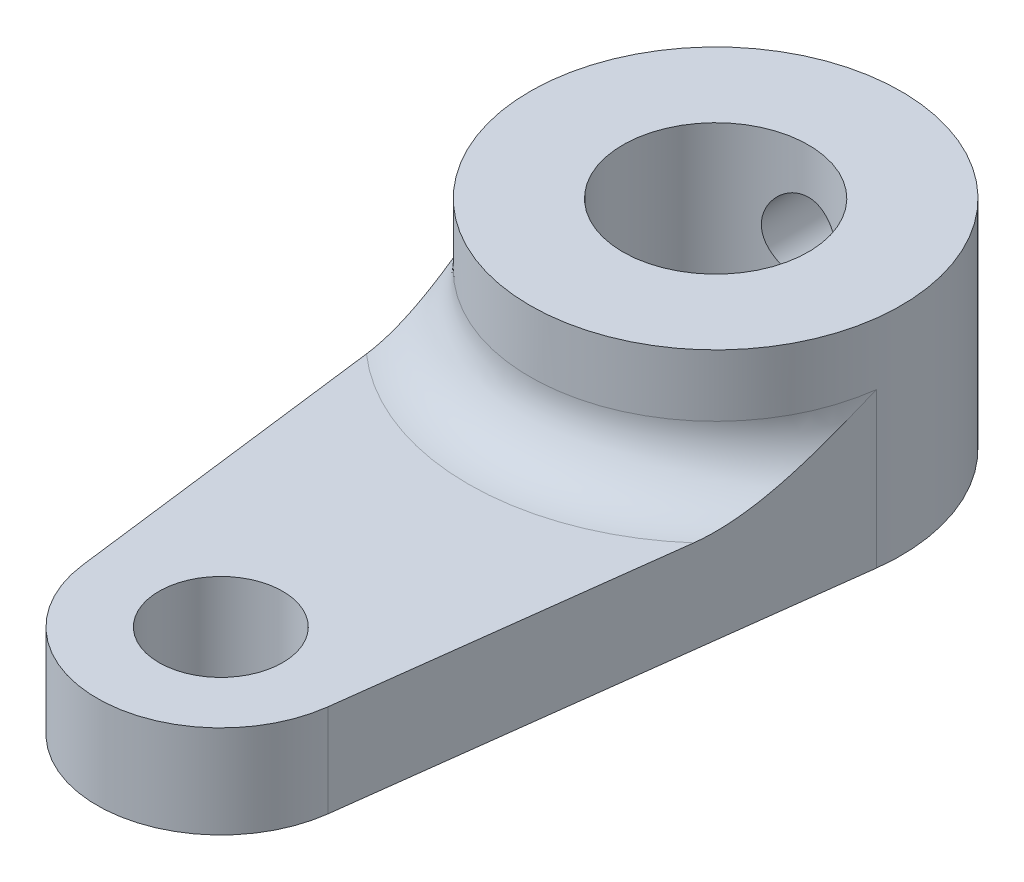
ISO-10303-21;
HEADER;
FILE_DESCRIPTION(('STEP AP214'),'2;1');
FILE_NAME('part.step','',(''),(''),'','','');
FILE_SCHEMA(('AUTOMOTIVE_DESIGN { 1 0 10303 214 1 1 1 1 }'));
ENDSEC;
DATA;
#1=APPLICATION_CONTEXT('core data for automotive mechanical design processes');
#2=APPLICATION_PROTOCOL_DEFINITION('international standard','automotive_design',2000,#1);
#3=PRODUCT_CONTEXT('',#1,'mechanical');
#4=PRODUCT('Part','Part','',(#3));
#5=PRODUCT_RELATED_PRODUCT_CATEGORY('part','',(#4));
#6=PRODUCT_DEFINITION_FORMATION('','',#4);
#7=PRODUCT_DEFINITION_CONTEXT('part definition',#1,'design');
#8=PRODUCT_DEFINITION('design','',#6,#7);
#9=PRODUCT_DEFINITION_SHAPE('','',#8);
#10=(LENGTH_UNIT() NAMED_UNIT(*) SI_UNIT(.MILLI.,.METRE.));
#11=(NAMED_UNIT(*) PLANE_ANGLE_UNIT() SI_UNIT($,.RADIAN.));
#12=(NAMED_UNIT(*) SI_UNIT($,.STERADIAN.) SOLID_ANGLE_UNIT());
#13=UNCERTAINTY_MEASURE_WITH_UNIT(LENGTH_MEASURE(1.E-05),#10,'distance_accuracy_value','');
#14=(GEOMETRIC_REPRESENTATION_CONTEXT(3) GLOBAL_UNCERTAINTY_ASSIGNED_CONTEXT((#13)) GLOBAL_UNIT_ASSIGNED_CONTEXT((#10,
#11,#12)) REPRESENTATION_CONTEXT('',''));
#15=CARTESIAN_POINT('',(0.,0.,0.));
#16=DIRECTION('',(0.,0.,1.));
#17=DIRECTION('',(1.,0.,0.));
#18=AXIS2_PLACEMENT_3D('',#15,#16,#17);
#19=CARTESIAN_POINT('',(-5.95294044989533,3.,0.750000000000001));
#20=DIRECTION('',(0.992156741649221,0.,-0.125));
#21=DIRECTION('',(-0.125,0.,-0.992156741649222));
#22=AXIS2_PLACEMENT_3D('',#19,#20,#21);
#23=PLANE('',#22);
#24=DIRECTION('',(0.125,0.,0.992156741649222));
#25=VECTOR('',#24,1.);
#26=CARTESIAN_POINT('',(-5.95294044989533,0.,0.750000000000001));
#27=LINE('',#26,#25);
#28=CARTESIAN_POINT('',(-5.95294044989533,0.,0.750000000000001));
#29=VERTEX_POINT('',#28);
#30=CARTESIAN_POINT('',(-3.96862696659688,0.,16.5));
#31=VERTEX_POINT('',#30);
#32=EDGE_CURVE('E167',#29,#31,#27,.T.);
#33=ORIENTED_EDGE('',*,*,#32,.T.);
#34=DIRECTION('',(0.,-1.,0.));
#35=VECTOR('',#34,1.);
#36=CARTESIAN_POINT('',(-3.96862696659688,3.,16.5));
#37=LINE('',#36,#35);
#38=CARTESIAN_POINT('',(-3.96862696659688,3.,16.5));
#39=VERTEX_POINT('',#38);
#40=EDGE_CURVE('E160',#39,#31,#37,.T.);
#41=ORIENTED_EDGE('',*,*,#40,.F.);
#42=DIRECTION('',(0.125,0.,0.992156741649222));
#43=VECTOR('',#42,1.);
#44=CARTESIAN_POINT('',(-5.95294044989533,3.,0.750000000000001));
#45=LINE('',#44,#43);
#46=CARTESIAN_POINT('',(-5.29150262212918,3.,6.00000000000001));
#47=VERTEX_POINT('',#46);
#48=EDGE_CURVE('E145',#47,#39,#45,.T.);
#49=ORIENTED_EDGE('',*,*,#48,.F.);
#50=CARTESIAN_POINT('',(-5.29150262212918,3.,6.));
#51=CARTESIAN_POINT('',(-5.310397819851,3.00003932371851,5.85002401756404));
#52=CARTESIAN_POINT('',(-5.32927068108449,3.00749080861603,5.70022532550789));
#53=CARTESIAN_POINT('',(-5.36682983971665,3.03529748814438,5.40210874592731));
#54=CARTESIAN_POINT('',(-5.38551644968357,3.05562506504866,5.25378837746932));
#55=CARTESIAN_POINT('',(-5.42237695613095,3.10690972129858,4.96121717769029));
#56=CARTESIAN_POINT('',(-5.44055436264534,3.13771036698731,4.81693848633871));
#57=CARTESIAN_POINT('',(-5.47663555915589,3.20848018103599,4.53055286742101));
#58=CARTESIAN_POINT('',(-5.49453918362412,3.24845467894677,4.38844725369214));
#59=CARTESIAN_POINT('',(-5.5510486235935,3.38804779430901,3.93991747903258));
#60=CARTESIAN_POINT('',(-5.58909054596903,3.50228369716539,3.63796908103118));
#61=CARTESIAN_POINT('',(-5.66384180156039,3.75580816906814,3.04464938357748));
#62=CARTESIAN_POINT('',(-5.70054954085285,3.89512559194255,2.75329073549981));
#63=CARTESIAN_POINT('',(-5.80963672037337,4.33812108027919,1.88743809078946));
#64=CARTESIAN_POINT('',(-5.88048240155337,4.66533067275,1.32511792919343));
#65=CARTESIAN_POINT('',(-5.95182241893324,4.99483605454566,0.758874095651245));
#66=CARTESIAN_POINT('',(-5.95238143594606,4.9974180439654,0.754437035667553));
#67=CARTESIAN_POINT('',(-5.95294044989533,5.,0.750000000000001));
#68=B_SPLINE_CURVE_WITH_KNOTS('',3,(#50,#51,#52,#53,#54,#55,#56,#57,#58,#59,#60,#61,#62,#63,#64,
#65,#66,#67),.UNSPECIFIED.,.F.,.F.,(4,2,2,2,2,2,2,2,4),(0.,0.453047985173654,0.905127510167307,
1.35073120961617,1.79659444088085,2.76988627914173,3.74430503334719,5.70583133706962,
5.72132327058452),.UNSPECIFIED.);
#69=CARTESIAN_POINT('',(-5.95294044989533,5.,0.750000000000001));
#70=VERTEX_POINT('',#69);
#71=EDGE_CURVE('E49',#47,#70,#68,.T.);
#72=ORIENTED_EDGE('',*,*,#71,.T.);
#73=DIRECTION('',(0.,-1.,0.));
#74=VECTOR('',#73,1.);
#75=CARTESIAN_POINT('',(-5.95294044989533,3.,0.750000000000001));
#76=LINE('',#75,#74);
#77=EDGE_CURVE('E332',#70,#29,#76,.T.);
#78=ORIENTED_EDGE('',*,*,#77,.T.);
#79=EDGE_LOOP('',(#33,#41,#49,#72,#78));
#80=FACE_BOUND('',#79,.T.);
#81=ADVANCED_FACE('F95',(#80),#23,.F.);
#82=CARTESIAN_POINT('',(0.,3.,16.));
#83=DIRECTION('',(0.,-1.,0.));
#84=DIRECTION('',(0.,0.,-1.));
#85=AXIS2_PLACEMENT_3D('',#82,#83,#84);
#86=CYLINDRICAL_SURFACE('',#85,4.);
#87=CARTESIAN_POINT('',(0.,0.,16.));
#88=DIRECTION('',(0.,1.,0.));
#89=DIRECTION('',(0.,0.,1.));
#90=AXIS2_PLACEMENT_3D('',#87,#88,#89);
#91=CIRCLE('',#90,4.);
#92=CARTESIAN_POINT('',(3.96862696659689,0.,16.5));
#93=VERTEX_POINT('',#92);
#94=EDGE_CURVE('E334',#31,#93,#91,.T.);
#95=ORIENTED_EDGE('',*,*,#94,.T.);
#96=DIRECTION('',(0.,-1.,0.));
#97=VECTOR('',#96,1.);
#98=CARTESIAN_POINT('',(3.96862696659689,3.,16.5));
#99=LINE('',#98,#97);
#100=CARTESIAN_POINT('',(3.96862696659689,3.,16.5));
#101=VERTEX_POINT('',#100);
#102=EDGE_CURVE('E162',#101,#93,#99,.T.);
#103=ORIENTED_EDGE('',*,*,#102,.F.);
#104=CARTESIAN_POINT('',(0.,3.,16.));
#105=DIRECTION('',(0.,1.,0.));
#106=DIRECTION('',(0.,0.,1.));
#107=AXIS2_PLACEMENT_3D('',#104,#105,#106);
#108=CIRCLE('',#107,4.);
#109=EDGE_CURVE('E149',#39,#101,#108,.T.);
#110=ORIENTED_EDGE('',*,*,#109,.F.);
#111=ORIENTED_EDGE('',*,*,#40,.T.);
#112=EDGE_LOOP('',(#95,#103,#110,#111));
#113=FACE_BOUND('',#112,.T.);
#114=ADVANCED_FACE('F159',(#113),#86,.T.);
#115=CARTESIAN_POINT('',(5.95294044989533,3.,0.75));
#116=DIRECTION('',(0.992156741649221,0.,0.125));
#117=DIRECTION('',(0.125,0.,-0.992156741649222));
#118=AXIS2_PLACEMENT_3D('',#115,#116,#117);
#119=PLANE('',#118);
#120=DIRECTION('',(-0.125,0.,0.992156741649222));
#121=VECTOR('',#120,1.);
#122=CARTESIAN_POINT('',(5.95294044989533,0.,0.75));
#123=LINE('',#122,#121);
#124=CARTESIAN_POINT('',(5.95294044989533,0.,0.749999999999999));
#125=VERTEX_POINT('',#124);
#126=EDGE_CURVE('E336',#125,#93,#123,.T.);
#127=ORIENTED_EDGE('',*,*,#126,.F.);
#128=DIRECTION('',(0.,-1.,0.));
#129=VECTOR('',#128,1.);
#130=CARTESIAN_POINT('',(5.95294044989533,3.,0.749999999999999));
#131=LINE('',#130,#129);
#132=CARTESIAN_POINT('',(5.95294044989533,5.,0.749999999999999));
#133=VERTEX_POINT('',#132);
#134=EDGE_CURVE('E172',#133,#125,#131,.T.);
#135=ORIENTED_EDGE('',*,*,#134,.F.);
#136=CARTESIAN_POINT('',(5.29150262212918,3.,6.));
#137=CARTESIAN_POINT('',(5.31039781985099,3.00003932371851,5.85002401756409));
#138=CARTESIAN_POINT('',(5.32927068108447,3.00749080861603,5.70022532550801));
#139=CARTESIAN_POINT('',(5.36682983971662,3.03529748814436,5.40210874592754));
#140=CARTESIAN_POINT('',(5.38551644968354,3.05562506504862,5.2537883774696));
#141=CARTESIAN_POINT('',(5.42237695613092,3.10690972129853,4.96121717769055));
#142=CARTESIAN_POINT('',(5.44055436264532,3.13771036698726,4.81693848633891));
#143=CARTESIAN_POINT('',(5.47663555915588,3.20848018103597,4.5305528674211));
#144=CARTESIAN_POINT('',(5.49453918362412,3.24845467894676,4.38844725369219));
#145=CARTESIAN_POINT('',(5.55104862359351,3.388047794309,3.93991747903254));
#146=CARTESIAN_POINT('',(5.58909054596904,3.50228369716534,3.63796908103107));
#147=CARTESIAN_POINT('',(5.66384180156041,3.75580816906828,3.04464938357737));
#148=CARTESIAN_POINT('',(5.70054954085285,3.89512559194294,2.75329073549976));
#149=CARTESIAN_POINT('',(5.80963672037344,4.33812108027873,1.8874380907889));
#150=CARTESIAN_POINT('',(5.88048240155366,4.66533067274692,1.32511792919142));
#151=CARTESIAN_POINT('',(5.95182241893326,4.99483605454567,0.75887409565111));
#152=CARTESIAN_POINT('',(5.95238143594607,4.9974180439654,0.754437035667485));
#153=CARTESIAN_POINT('',(5.95294044989533,5.,0.75));
#154=B_SPLINE_CURVE_WITH_KNOTS('',3,(#136,#137,#138,#139,#140,#141,#142,#143,#144,#145,#146,
#147,#148,#149,#150,#151,#152,#153),.UNSPECIFIED.,.F.,.F.,(4,2,2,2,2,2,2,2,4),(0.,
0.453047985173469,0.905127510166978,1.35073120961602,1.79659444088085,2.76988627914183,
3.74430503334748,5.70583133706981,5.72132327058452),.UNSPECIFIED.);
#155=CARTESIAN_POINT('',(5.29150262212918,3.,6.));
#156=VERTEX_POINT('',#155);
#157=EDGE_CURVE('E109',#133,#156,#154,.F.);
#158=ORIENTED_EDGE('',*,*,#157,.T.);
#159=DIRECTION('',(-0.125,0.,0.992156741649222));
#160=VECTOR('',#159,1.);
#161=CARTESIAN_POINT('',(5.95294044989533,3.,0.75));
#162=LINE('',#161,#160);
#163=EDGE_CURVE('E163',#156,#101,#162,.T.);
#164=ORIENTED_EDGE('',*,*,#163,.T.);
#165=ORIENTED_EDGE('',*,*,#102,.T.);
#166=EDGE_LOOP('',(#127,#135,#158,#164,#165));
#167=FACE_BOUND('',#166,.T.);
#168=ADVANCED_FACE('F184',(#167),#119,.T.);
#169=CARTESIAN_POINT('',(0.,3.,0.));
#170=DIRECTION('',(0.,-1.,0.));
#171=DIRECTION('',(0.,0.,-1.));
#172=AXIS2_PLACEMENT_3D('',#169,#170,#171);
#173=CYLINDRICAL_SURFACE('',#172,3.);
#174=CARTESIAN_POINT('',(0.,5.53515299842047,-3.));
#175=CARTESIAN_POINT('',(-0.0669580526362667,5.53514579332917,-2.99999458367273));
#176=CARTESIAN_POINT('',(-0.134021397063841,5.52974103989234,-2.9977323297471));
#177=CARTESIAN_POINT('',(-0.266247371156347,5.50831393350029,-2.98890153579552));
#178=CARTESIAN_POINT('',(-0.331404576423564,5.49226387395622,-2.98232175901028));
#179=CARTESIAN_POINT('',(-0.457688733653087,5.45024190663988,-2.96556289038127));
#180=CARTESIAN_POINT('',(-0.518828524426268,5.42430360895232,-2.95539599975004));
#181=CARTESIAN_POINT('',(-0.635829756679802,5.3633801751879,-2.93245286470664));
#182=CARTESIAN_POINT('',(-0.691692790015939,5.32839777944961,-2.91967741092849));
#183=CARTESIAN_POINT('',(-0.799448403559511,5.24852401582959,-2.89207828351869));
#184=CARTESIAN_POINT('',(-0.851041267517768,5.20325168963072,-2.87718753326093));
#185=CARTESIAN_POINT('',(-0.946159821091261,5.1048886636379,-2.84732714068514));
#186=CARTESIAN_POINT('',(-0.989681263153085,5.05179387352596,-2.83235746106809));
#187=CARTESIAN_POINT('',(-1.06953737697065,4.93612622085558,-2.80321021812995));
#188=CARTESIAN_POINT('',(-1.10541308153925,4.87321554999393,-2.78910786873385));
#189=CARTESIAN_POINT('',(-1.16593940588866,4.74157974049954,-2.76435572357005));
#190=CARTESIAN_POINT('',(-1.19059580836291,4.67285761893602,-2.75370415000824));
#191=CARTESIAN_POINT('',(-1.22674598312159,4.53499930665255,-2.73778555387705));
#192=CARTESIAN_POINT('',(-1.23881657877605,4.46604251502832,-2.73228387651787));
#193=CARTESIAN_POINT('',(-1.25125209967796,4.3268797057339,-2.72661326219504));
#194=CARTESIAN_POINT('',(-1.25162348054397,4.25667439839473,-2.7264413842526));
#195=CARTESIAN_POINT('',(-1.24108450363674,4.12275293798553,-2.73125119560853));
#196=CARTESIAN_POINT('',(-1.23103681112301,4.05895190185601,-2.73583882723623));
#197=CARTESIAN_POINT('',(-1.20139191015777,3.93404090742008,-2.74898482773796));
#198=CARTESIAN_POINT('',(-1.18179287287177,3.8729314669287,-2.75754395703564));
#199=CARTESIAN_POINT('',(-1.13321958727571,3.75359529542903,-2.77786184772756));
#200=CARTESIAN_POINT('',(-1.10405471539236,3.69545757750709,-2.78968481949136));
#201=CARTESIAN_POINT('',(-1.03731242580562,3.58467526454033,-2.81518331141086));
#202=CARTESIAN_POINT('',(-0.999731690519544,3.53203284780695,-2.82885956129779));
#203=CARTESIAN_POINT('',(-0.913495965543835,3.42905303968763,-2.85792976877979));
#204=CARTESIAN_POINT('',(-0.864173483207526,3.37928643103504,-2.87337121404473));
#205=CARTESIAN_POINT('',(-0.757729591051512,3.28853949546129,-2.90325673112529));
#206=CARTESIAN_POINT('',(-0.700606359448457,3.24756122672829,-2.9177005687701));
#207=CARTESIAN_POINT('',(-0.578447948693377,3.17471717480421,-2.94438283556473));
#208=CARTESIAN_POINT('',(-0.513260582447681,3.14308355326979,-2.95656266543334));
#209=CARTESIAN_POINT('',(-0.377852402526832,3.09143185881721,-2.97689481414803));
#210=CARTESIAN_POINT('',(-0.307634394795035,3.07140736647666,-2.985049358458));
#211=CARTESIAN_POINT('',(-0.168928113346229,3.04473700629384,-2.99599641186385));
#212=CARTESIAN_POINT('',(-0.10061128527864,3.03732514097672,-2.99909541047125));
#213=CARTESIAN_POINT('',(0.0363546554960885,3.03380677480638,-3.00056050368745));
#214=CARTESIAN_POINT('',(0.105003667152635,3.03769702816847,-2.99892795711939));
#215=CARTESIAN_POINT('',(0.237098242341434,3.05612408322654,-2.9913121765694));
#216=CARTESIAN_POINT('',(0.300632966639385,3.07012295251767,-2.9855488728399));
#217=CARTESIAN_POINT('',(0.424382748971089,3.10762119296126,-2.97048606772414));
#218=CARTESIAN_POINT('',(0.48459738651836,3.13112176437077,-2.96118611959704));
#219=CARTESIAN_POINT('',(0.602108999869136,3.18772397413259,-2.93958270645166));
#220=CARTESIAN_POINT('',(0.659257236855323,3.22110118156651,-2.92719491469281));
#221=CARTESIAN_POINT('',(0.767346216231429,3.29620637621217,-2.9007380457909));
#222=CARTESIAN_POINT('',(0.81828435260194,3.33793784994975,-2.88666826768733));
#223=CARTESIAN_POINT('',(0.916333430274263,3.43205623169288,-2.85712087895438));
#224=CARTESIAN_POINT('',(0.962910697979835,3.48499150140673,-2.84161451591029));
#225=CARTESIAN_POINT('',(1.04666984610551,3.59817427435586,-2.81184336768005));
#226=CARTESIAN_POINT('',(1.08384959285617,3.65842343359221,-2.79757886493439));
#227=CARTESIAN_POINT('',(1.14815960208699,3.78576717372305,-2.77181386243988));
#228=CARTESIAN_POINT('',(1.17513918237329,3.8529470339353,-2.76035562555112));
#229=CARTESIAN_POINT('',(1.21717413951573,3.99152359223058,-2.74208355658957));
#230=CARTESIAN_POINT('',(1.23223934863687,4.06291676090382,-2.73526589555752));
#231=CARTESIAN_POINT('',(1.249040803489,4.20197169761968,-2.72763164537264));
#232=CARTESIAN_POINT('',(1.25171380413129,4.26949766071309,-2.72639350967163));
#233=CARTESIAN_POINT('',(1.24615575523912,4.40399585956157,-2.72893853011024));
#234=CARTESIAN_POINT('',(1.23792637964721,4.47096817873417,-2.73272091540306));
#235=CARTESIAN_POINT('',(1.21158404780491,4.59924574588936,-2.74449551302268));
#236=CARTESIAN_POINT('',(1.19394903571466,4.66066967188386,-2.7522835484648));
#237=CARTESIAN_POINT('',(1.14976328202134,4.7797010197777,-2.77103181199189));
#238=CARTESIAN_POINT('',(1.12321003517252,4.83730736381925,-2.78199293131693));
#239=CARTESIAN_POINT('',(1.06010285935489,4.95084889436959,-2.80666954560013));
#240=CARTESIAN_POINT('',(1.02304360910483,5.00647532858876,-2.82051102713679));
#241=CARTESIAN_POINT('',(0.940684072630391,5.11101313778115,-2.84903689053839));
#242=CARTESIAN_POINT('',(0.895380928905619,5.15992217402104,-2.86372156345875));
#243=CARTESIAN_POINT('',(0.793902045778821,5.25330168010521,-2.89356392850106));
#244=CARTESIAN_POINT('',(0.737174739949028,5.29718943126112,-2.90867817511792));
#245=CARTESIAN_POINT('',(0.616600079253199,5.3748524519641,-2.9366014362202));
#246=CARTESIAN_POINT('',(0.552749497945746,5.40862311331003,-2.9494093991674));
#247=CARTESIAN_POINT('',(0.420732056717951,5.46436284386036,-2.97109183362461));
#248=CARTESIAN_POINT('',(0.352653990980636,5.48651776503777,-2.98002782581964));
#249=CARTESIAN_POINT('',(0.213410421846559,5.51885932749831,-2.99321009768625));
#250=CARTESIAN_POINT('',(0.142255316980957,5.52908344095036,-2.99747105811967));
#251=CARTESIAN_POINT('',(0.0472360819191832,5.53448615950692,-2.99972287568934));
#252=CARTESIAN_POINT('',(0.023624594675657,5.53515554056969,-3.00000191102536));
#253=CARTESIAN_POINT('',(0.,5.53515299842047,-3.));
#254=B_SPLINE_CURVE_WITH_KNOTS('',3,(#174,#175,#176,#177,#178,#179,#180,#181,#182,#183,#184,
#185,#186,#187,#188,#189,#190,#191,#192,#193,#194,#195,#196,#197,#198,#199,#200,#201,#202,#203,
#204,#205,#206,#207,#208,#209,#210,#211,#212,#213,#214,#215,#216,#217,#218,#219,#220,#221,#222,
#223,#224,#225,#226,#227,#228,#229,#230,#231,#232,#233,#234,#235,#236,#237,#238,#239,#240,#241,
#242,#243,#244,#245,#246,#247,#248,#249,#250,#251,#252,#253),.UNSPECIFIED.,.T.,.F.,(4,2,2,2,2,2,
2,2,2,2,2,2,2,2,2,2,2,2,2,2,2,2,2,2,2,2,2,2,2,2,2,2,2,2,2,2,2,2,2,4),(0.,0.200806918883938,
0.402138540628696,0.602791851906301,0.803384436852974,1.01317936288807,1.22308438131465,
1.44331724539125,1.66343646730588,1.87295273137557,2.08235338249046,2.27570157202556,
2.46908679727212,2.66658713058714,2.86416545717206,3.07844141127896,3.29276749314588,
3.51204055060813,3.73119224218297,3.93648443393251,4.14171767493172,4.33676589735721,
4.53183876601785,4.73297135272161,4.93418805469496,5.14978488029294,5.36543061240341,
5.58414788359523,5.8026844707458,6.00439877559643,6.20608211297536,6.39837649964762,
6.59072494950612,6.79463893397441,6.99862373425943,7.21746535004889,7.43640649428582,
7.65172855819385,7.86637250469321,7.93722256499098),.UNSPECIFIED.);
#255=CARTESIAN_POINT('',(0.,5.53515299842047,-3.));
#256=VERTEX_POINT('',#255);
#257=EDGE_CURVE('E317',#256,#256,#254,.T.);
#258=ORIENTED_EDGE('',*,*,#257,.F.);
#259=EDGE_LOOP('',(#258));
#260=FACE_BOUND('',#259,.T.);
#261=CARTESIAN_POINT('',(0.,0.,0.));
#262=DIRECTION('',(0.,1.,0.));
#263=DIRECTION('',(0.,0.,1.));
#264=AXIS2_PLACEMENT_3D('',#261,#262,#263);
#265=CIRCLE('',#264,3.);
#266=CARTESIAN_POINT('',(0.,0.,3.));
#267=VERTEX_POINT('',#266);
#268=EDGE_CURVE('E341',#267,#267,#265,.T.);
#269=ORIENTED_EDGE('',*,*,#268,.F.);
#270=EDGE_LOOP('',(#269));
#271=FACE_BOUND('',#270,.T.);
#272=CARTESIAN_POINT('',(0.,7.,0.));
#273=DIRECTION('',(0.,1.,0.));
#274=DIRECTION('',(0.,0.,1.));
#275=AXIS2_PLACEMENT_3D('',#272,#273,#274);
#276=CIRCLE('',#275,3.);
#277=CARTESIAN_POINT('',(0.,7.,3.));
#278=VERTEX_POINT('',#277);
#279=EDGE_CURVE('E321',#278,#278,#276,.T.);
#280=ORIENTED_EDGE('',*,*,#279,.T.);
#281=EDGE_LOOP('',(#280));
#282=FACE_BOUND('',#281,.T.);
#283=ADVANCED_FACE('F188',(#260,#271,#282),#173,.F.);
#284=CARTESIAN_POINT('',(0.,3.,0.));
#285=DIRECTION('',(0.,-1.,0.));
#286=DIRECTION('',(0.,0.,-1.));
#287=AXIS2_PLACEMENT_3D('',#284,#285,#286);
#288=CYLINDRICAL_SURFACE('',#287,6.);
#289=CARTESIAN_POINT('',(0.,5.53515299842047,-6.));
#290=CARTESIAN_POINT('',(-0.0694090417016606,5.53515052095125,-5.99999871526651));
#291=CARTESIAN_POINT('',(-0.138848789520875,5.52935233270172,-5.99878328775043));
#292=CARTESIAN_POINT('',(-0.275761316266993,5.50633364888762,-5.9940520099068));
#293=CARTESIAN_POINT('',(-0.343232560128312,5.48910447538354,-5.99053441189248));
#294=CARTESIAN_POINT('',(-0.474209132291342,5.44378254349865,-5.98159109196202));
#295=CARTESIAN_POINT('',(-0.537718336709184,5.41570060242158,-5.97616727052645));
#296=CARTESIAN_POINT('',(-0.659120328605958,5.34950338956429,-5.96399927809859));
#297=CARTESIAN_POINT('',(-0.717013367534326,5.31138856726464,-5.95725516625975));
#298=CARTESIAN_POINT('',(-0.826390324308836,5.22561665822983,-5.9430770002465));
#299=CARTESIAN_POINT('',(-0.877780244162685,5.17784099718539,-5.93563505848531));
#300=CARTESIAN_POINT('',(-0.971877776769392,5.07435833922536,-5.92095657692448));
#301=CARTESIAN_POINT('',(-1.01458467096099,5.01865068654821,-5.91372005416683));
#302=CARTESIAN_POINT('',(-1.09051031677217,4.90020102965431,-5.90019442595308));
#303=CARTESIAN_POINT('',(-1.12363054680651,4.83739461391773,-5.89391545174828));
#304=CARTESIAN_POINT('',(-1.17881119348064,4.70695554664772,-5.8831284065002));
#305=CARTESIAN_POINT('',(-1.20087280167641,4.63932341597793,-5.87862014467568));
#306=CARTESIAN_POINT('',(-1.23300240133737,4.50216776100483,-5.87196500986123));
#307=CARTESIAN_POINT('',(-1.24323597696799,4.43268463908571,-5.86978556855865));
#308=CARTESIAN_POINT('',(-1.25193357655615,4.29295615555784,-5.86793690716491));
#309=CARTESIAN_POINT('',(-1.25039890894687,4.22271087955518,-5.86826740800981));
#310=CARTESIAN_POINT('',(-1.23573719037197,4.0846719704453,-5.87137174319175));
#311=CARTESIAN_POINT('',(-1.2228010523272,4.01685701875926,-5.87410533679901));
#312=CARTESIAN_POINT('',(-1.18600543529945,3.88438148877554,-5.88164437615942));
#313=CARTESIAN_POINT('',(-1.16214539481382,3.81972107281414,-5.88644992841317));
#314=CARTESIAN_POINT('',(-1.10400003213928,3.69484577000449,-5.89763191464102));
#315=CARTESIAN_POINT('',(-1.06964002534237,3.6346667018934,-5.90401953785586));
#316=CARTESIAN_POINT('',(-0.991522699274817,3.52085725415231,-5.91763890010721));
#317=CARTESIAN_POINT('',(-0.947764212262587,3.4672276895845,-5.92487074398537));
#318=CARTESIAN_POINT('',(-0.851074921546782,3.3669390373401,-5.93953730929909));
#319=CARTESIAN_POINT('',(-0.797981433412082,3.32043682952346,-5.94697323199473));
#320=CARTESIAN_POINT('',(-0.684667288611797,3.2369725561915,-5.96108088143001));
#321=CARTESIAN_POINT('',(-0.624446525025765,3.20001063382208,-5.96775259670236));
#322=CARTESIAN_POINT('',(-0.498405541235478,3.13664291688452,-5.97959870942815));
#323=CARTESIAN_POINT('',(-0.4325754619265,3.11025619385335,-5.98477039710258));
#324=CARTESIAN_POINT('',(-0.297284620972155,3.06896129358498,-5.99301338211281));
#325=CARTESIAN_POINT('',(-0.227824338595089,3.05405160518907,-5.99608495596053));
#326=CARTESIAN_POINT('',(-0.0885918657008348,3.03635874635259,-5.99974275215456));
#327=CARTESIAN_POINT('',(-0.0188480555261784,3.03336105692622,-6.00037293537579));
#328=CARTESIAN_POINT('',(0.120143798757714,3.03899794838958,-5.99919952252774));
#329=CARTESIAN_POINT('',(0.189391872962258,3.04763181702207,-5.99739607548153));
#330=CARTESIAN_POINT('',(0.324726367119813,3.07610865189001,-5.99158564979184));
#331=CARTESIAN_POINT('',(0.390837192894206,3.09584048380394,-5.98760052868077));
#332=CARTESIAN_POINT('',(0.518811446661331,3.14583085884188,-5.97787227242395));
#333=CARTESIAN_POINT('',(0.580674536336775,3.17609023928645,-5.97212899744579));
#334=CARTESIAN_POINT('',(0.699294306943494,3.24673337665803,-5.95941241490714));
#335=CARTESIAN_POINT('',(0.755973219469834,3.28724492798953,-5.9524239381233));
#336=CARTESIAN_POINT('',(0.86180544588652,3.37707256149674,-5.93802568299709));
#337=CARTESIAN_POINT('',(0.910957877913285,3.42638967393941,-5.93061585542511));
#338=CARTESIAN_POINT('',(1.0011786486518,3.53340857542017,-5.91606024531377));
#339=CARTESIAN_POINT('',(1.04209914600204,3.59123603037575,-5.90892089307501));
#340=CARTESIAN_POINT('',(1.11364719079243,3.71306928263426,-5.89585601015805));
#341=CARTESIAN_POINT('',(1.14427516677864,3.77707482255958,-5.88993042894651));
#342=CARTESIAN_POINT('',(1.19417246443922,3.9091141947187,-5.88001700708041));
#343=CARTESIAN_POINT('',(1.21350309828031,3.97712403558631,-5.87601872784687));
#344=CARTESIAN_POINT('',(1.24044038523407,4.11551954891273,-5.87039184709697));
#345=CARTESIAN_POINT('',(1.24804871544441,4.18590488003991,-5.86876290660367));
#346=CARTESIAN_POINT('',(1.25125926487611,4.32556639942012,-5.86807907308506));
#347=CARTESIAN_POINT('',(1.24709542622725,4.39483706864253,-5.86897402321502));
#348=CARTESIAN_POINT('',(1.22739905314032,4.53166700734069,-5.87312447254928));
#349=CARTESIAN_POINT('',(1.21186662782266,4.59922629323658,-5.87637994909626));
#350=CARTESIAN_POINT('',(1.16998217768585,4.73055077031113,-5.88486132447716));
#351=CARTESIAN_POINT('',(1.14366117568421,4.7943262449074,-5.8900815700793));
#352=CARTESIAN_POINT('',(1.08097457299757,4.91659177444714,-5.90190705738738));
#353=CARTESIAN_POINT('',(1.0446080398303,4.9750813380536,-5.9085124276546));
#354=CARTESIAN_POINT('',(0.96207369534241,5.08627462549992,-5.92251579551146));
#355=CARTESIAN_POINT('',(0.915737890418225,5.13885212298546,-5.92992613868404));
#356=CARTESIAN_POINT('',(0.814924438115334,5.23556249164683,-5.94461839583213));
#357=CARTESIAN_POINT('',(0.760444918832968,5.27969341597196,-5.9519002798488));
#358=CARTESIAN_POINT('',(0.644134427507703,5.35874157160453,-5.96561444547637));
#359=CARTESIAN_POINT('',(0.582225921521349,5.39354667830676,-5.97203596073244));
#360=CARTESIAN_POINT('',(0.453319843998454,5.45220322685049,-5.98319908494092));
#361=CARTESIAN_POINT('',(0.386326781907244,5.47606424560235,-5.98794216182101));
#362=CARTESIAN_POINT('',(0.266015292900105,5.5076932767089,-5.99432499781444));
#363=CARTESIAN_POINT('',(0.213367593727929,5.51797176162933,-5.99644035661395));
#364=CARTESIAN_POINT('',(0.107152674176537,5.5317024526978,-5.99927832789758));
#365=CARTESIAN_POINT('',(0.0535854878488718,5.53515491108766,-6.00000099184586));
#366=CARTESIAN_POINT('',(0.,5.53515299842047,-6.));
#367=B_SPLINE_CURVE_WITH_KNOTS('',3,(#289,#290,#291,#292,#293,#294,#295,#296,#297,#298,#299,
#300,#301,#302,#303,#304,#305,#306,#307,#308,#309,#310,#311,#312,#313,#314,#315,#316,#317,#318,
#319,#320,#321,#322,#323,#324,#325,#326,#327,#328,#329,#330,#331,#332,#333,#334,#335,#336,#337,
#338,#339,#340,#341,#342,#343,#344,#345,#346,#347,#348,#349,#350,#351,#352,#353,#354,#355,#356,
#357,#358,#359,#360,#361,#362,#363,#364,#365,#366),.UNSPECIFIED.,.T.,.F.,(4,2,2,2,2,2,2,2,2,2,2,
2,2,2,2,2,2,2,2,2,2,2,2,2,2,2,2,2,2,2,2,2,2,2,2,2,2,2,4),(0.,0.208031045103183,
0.416220199906225,0.624202378825442,0.832175241572989,1.04287526388123,1.25359271551786,
1.46640449178548,1.6791933328549,1.88896575169854,2.09871484767164,2.30501712129059,
2.5113300003028,2.71914592416749,2.92698768368034,3.13889526355466,3.35080602278218,
3.56309724499662,3.77536051045771,3.98378339407675,4.19219351552277,4.39855286632621,
4.60492863390933,4.81401583995736,5.02312752564574,5.23571263829336,5.44828889851309,
5.65970050095025,5.87108185414184,6.07829223291038,6.28550062281361,6.49211731393255,
6.6987531908148,6.90919024830308,7.11967575117369,7.33258864398255,7.54531486464973,
7.70592588477279,7.86653096973391),.UNSPECIFIED.);
#368=CARTESIAN_POINT('',(0.,5.53515299842047,-6.));
#369=VERTEX_POINT('',#368);
#370=EDGE_CURVE('E100',#369,#369,#367,.T.);
#371=ORIENTED_EDGE('',*,*,#370,.T.);
#372=EDGE_LOOP('',(#371));
#373=FACE_BOUND('',#372,.T.);
#374=CARTESIAN_POINT('',(0.,5.,0.));
#375=DIRECTION('',(0.,1.,0.));
#376=DIRECTION('',(0.,0.,1.));
#377=AXIS2_PLACEMENT_3D('',#374,#375,#376);
#378=CIRCLE('',#377,6.);
#379=EDGE_CURVE('E168',#70,#133,#378,.T.);
#380=ORIENTED_EDGE('',*,*,#379,.T.);
#381=ORIENTED_EDGE('',*,*,#134,.T.);
#382=CARTESIAN_POINT('',(0.,0.,0.));
#383=DIRECTION('',(0.,1.,0.));
#384=DIRECTION('',(0.,0.,1.));
#385=AXIS2_PLACEMENT_3D('',#382,#383,#384);
#386=CIRCLE('',#385,6.);
#387=EDGE_CURVE('E339',#125,#29,#386,.T.);
#388=ORIENTED_EDGE('',*,*,#387,.T.);
#389=ORIENTED_EDGE('',*,*,#77,.F.);
#390=EDGE_LOOP('',(#380,#381,#388,#389));
#391=FACE_BOUND('',#390,.T.);
#392=CARTESIAN_POINT('',(0.,7.,0.));
#393=DIRECTION('',(0.,1.,0.));
#394=DIRECTION('',(0.,0.,1.));
#395=AXIS2_PLACEMENT_3D('',#392,#393,#394);
#396=CIRCLE('',#395,6.);
#397=CARTESIAN_POINT('',(0.,7.,6.));
#398=VERTEX_POINT('',#397);
#399=EDGE_CURVE('E325',#398,#398,#396,.T.);
#400=ORIENTED_EDGE('',*,*,#399,.F.);
#401=EDGE_LOOP('',(#400));
#402=FACE_BOUND('',#401,.T.);
#403=ADVANCED_FACE('F189',(#373,#391,#402),#288,.T.);
#404=CARTESIAN_POINT('',(0.,3.,16.));
#405=DIRECTION('',(0.,-1.,0.));
#406=DIRECTION('',(0.,0.,-1.));
#407=AXIS2_PLACEMENT_3D('',#404,#405,#406);
#408=CYLINDRICAL_SURFACE('',#407,2.);
#409=CARTESIAN_POINT('',(0.,3.,16.));
#410=DIRECTION('',(0.,1.,0.));
#411=DIRECTION('',(0.,0.,1.));
#412=AXIS2_PLACEMENT_3D('',#409,#410,#411);
#413=CIRCLE('',#412,2.);
#414=CARTESIAN_POINT('',(0.,3.,18.));
#415=VERTEX_POINT('',#414);
#416=EDGE_CURVE('E329',#415,#415,#413,.T.);
#417=ORIENTED_EDGE('',*,*,#416,.T.);
#418=EDGE_LOOP('',(#417));
#419=FACE_BOUND('',#418,.T.);
#420=CARTESIAN_POINT('',(0.,0.,16.));
#421=DIRECTION('',(0.,1.,0.));
#422=DIRECTION('',(0.,0.,1.));
#423=AXIS2_PLACEMENT_3D('',#420,#421,#422);
#424=CIRCLE('',#423,2.);
#425=CARTESIAN_POINT('',(0.,0.,18.));
#426=VERTEX_POINT('',#425);
#427=EDGE_CURVE('E154',#426,#426,#424,.T.);
#428=ORIENTED_EDGE('',*,*,#427,.F.);
#429=EDGE_LOOP('',(#428));
#430=FACE_BOUND('',#429,.T.);
#431=ADVANCED_FACE('F221',(#419,#430),#408,.F.);
#432=CARTESIAN_POINT('',(0.,3.,0.));
#433=DIRECTION('',(0.,1.,0.));
#434=DIRECTION('',(0.,0.,1.));
#435=AXIS2_PLACEMENT_3D('',#432,#433,#434);
#436=PLANE('',#435);
#437=ORIENTED_EDGE('',*,*,#163,.F.);
#438=CARTESIAN_POINT('',(0.,3.,0.));
#439=DIRECTION('',(0.,1.,0.));
#440=DIRECTION('',(0.,0.,1.));
#441=AXIS2_PLACEMENT_3D('',#438,#439,#440);
#442=CIRCLE('',#441,8.);
#443=EDGE_CURVE('E122',#156,#47,#442,.F.);
#444=ORIENTED_EDGE('',*,*,#443,.T.);
#445=ORIENTED_EDGE('',*,*,#48,.T.);
#446=ORIENTED_EDGE('',*,*,#109,.T.);
#447=EDGE_LOOP('',(#437,#444,#445,#446));
#448=FACE_BOUND('',#447,.T.);
#449=ORIENTED_EDGE('',*,*,#416,.F.);
#450=EDGE_LOOP('',(#449));
#451=FACE_BOUND('',#450,.T.);
#452=ADVANCED_FACE('F147',(#448,#451),#436,.T.);
#453=CARTESIAN_POINT('',(0.,0.,0.));
#454=DIRECTION('',(0.,1.,0.));
#455=DIRECTION('',(0.,0.,1.));
#456=AXIS2_PLACEMENT_3D('',#453,#454,#455);
#457=PLANE('',#456);
#458=ORIENTED_EDGE('',*,*,#32,.F.);
#459=ORIENTED_EDGE('',*,*,#387,.F.);
#460=ORIENTED_EDGE('',*,*,#126,.T.);
#461=ORIENTED_EDGE('',*,*,#94,.F.);
#462=EDGE_LOOP('',(#458,#459,#460,#461));
#463=FACE_BOUND('',#462,.T.);
#464=ORIENTED_EDGE('',*,*,#268,.T.);
#465=EDGE_LOOP('',(#464));
#466=FACE_BOUND('',#465,.T.);
#467=ORIENTED_EDGE('',*,*,#427,.T.);
#468=EDGE_LOOP('',(#467));
#469=FACE_BOUND('',#468,.T.);
#470=ADVANCED_FACE('F235',(#463,#466,#469),#457,.F.);
#471=CARTESIAN_POINT('',(0.,7.,0.));
#472=DIRECTION('',(0.,1.,0.));
#473=DIRECTION('',(0.,0.,1.));
#474=AXIS2_PLACEMENT_3D('',#471,#472,#473);
#475=PLANE('',#474);
#476=ORIENTED_EDGE('',*,*,#399,.T.);
#477=EDGE_LOOP('',(#476));
#478=FACE_BOUND('',#477,.T.);
#479=ORIENTED_EDGE('',*,*,#279,.F.);
#480=EDGE_LOOP('',(#479));
#481=FACE_BOUND('',#480,.T.);
#482=ADVANCED_FACE('F241',(#478,#481),#475,.T.);
#483=CARTESIAN_POINT('',(0.,5.,0.));
#484=DIRECTION('',(0.,1.,0.));
#485=DIRECTION('',(0.,0.,1.));
#486=AXIS2_PLACEMENT_3D('',#483,#484,#485);
#487=TOROIDAL_SURFACE('',#486,8.,2.);
#488=ORIENTED_EDGE('',*,*,#71,.F.);
#489=ORIENTED_EDGE('',*,*,#443,.F.);
#490=ORIENTED_EDGE('',*,*,#157,.F.);
#491=ORIENTED_EDGE('',*,*,#379,.F.);
#492=EDGE_LOOP('',(#488,#489,#490,#491));
#493=FACE_BOUND('',#492,.T.);
#494=ADVANCED_FACE('F97',(#493),#487,.F.);
#495=CARTESIAN_POINT('',(0.,4.28515299842047,-10.));
#496=DIRECTION('',(0.,0.,-1.));
#497=DIRECTION('',(-1.,0.,0.));
#498=AXIS2_PLACEMENT_3D('',#495,#496,#497);
#499=CYLINDRICAL_SURFACE('',#498,1.25);
#500=ORIENTED_EDGE('',*,*,#257,.T.);
#501=EDGE_LOOP('',(#500));
#502=FACE_BOUND('',#501,.T.);
#503=ORIENTED_EDGE('',*,*,#370,.F.);
#504=EDGE_LOOP('',(#503));
#505=FACE_BOUND('',#504,.T.);
#506=ADVANCED_FACE('F254',(#502,#505),#499,.F.);
#507=CLOSED_SHELL('',(#81,#114,#168,#283,#403,#431,#452,#470,#482,#494,#506));
#508=MANIFOLD_SOLID_BREP('B6',#507);
#509=ADVANCED_BREP_SHAPE_REPRESENTATION('',(#18,#508),#14);
#510=SHAPE_DEFINITION_REPRESENTATION(#9,#509);
ENDSEC;
END-ISO-10303-21;
